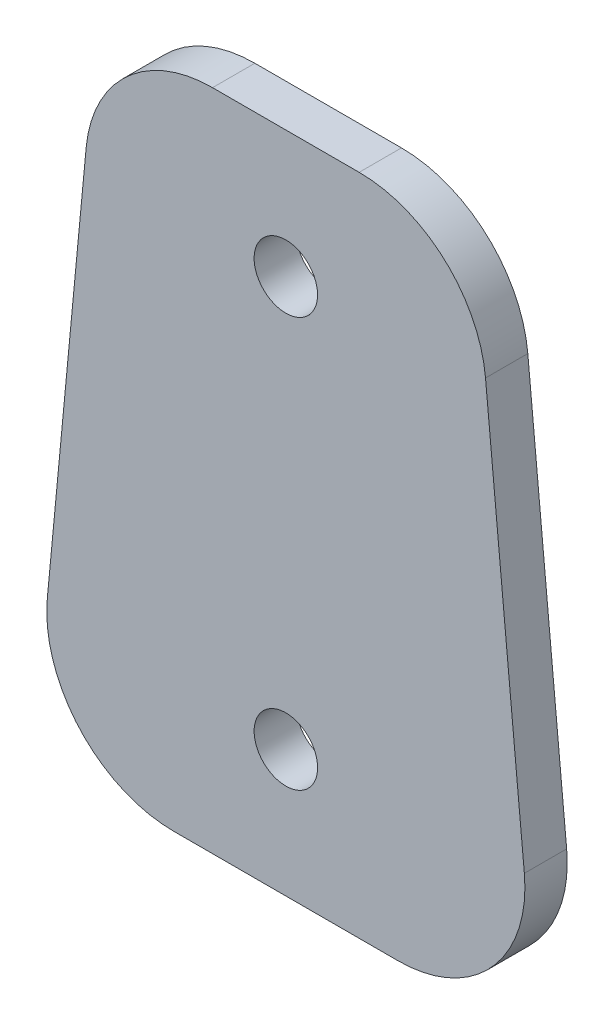
ISO-10303-21;
HEADER;
FILE_DESCRIPTION(('STEP AP214'),'2;1');
FILE_NAME('part.step','',(''),(''),'','','');
FILE_SCHEMA(('AUTOMOTIVE_DESIGN { 1 0 10303 214 1 1 1 1 }'));
ENDSEC;
DATA;
#1=APPLICATION_CONTEXT('core data for automotive mechanical design processes');
#2=APPLICATION_PROTOCOL_DEFINITION('international standard','automotive_design',2000,#1);
#3=PRODUCT_CONTEXT('',#1,'mechanical');
#4=PRODUCT('Part','Part','',(#3));
#5=PRODUCT_RELATED_PRODUCT_CATEGORY('part','',(#4));
#6=PRODUCT_DEFINITION_FORMATION('','',#4);
#7=PRODUCT_DEFINITION_CONTEXT('part definition',#1,'design');
#8=PRODUCT_DEFINITION('design','',#6,#7);
#9=PRODUCT_DEFINITION_SHAPE('','',#8);
#10=(LENGTH_UNIT() NAMED_UNIT(*) SI_UNIT(.MILLI.,.METRE.));
#11=(NAMED_UNIT(*) PLANE_ANGLE_UNIT() SI_UNIT($,.RADIAN.));
#12=(NAMED_UNIT(*) SI_UNIT($,.STERADIAN.) SOLID_ANGLE_UNIT());
#13=UNCERTAINTY_MEASURE_WITH_UNIT(LENGTH_MEASURE(1.E-05),#10,'distance_accuracy_value','');
#14=(GEOMETRIC_REPRESENTATION_CONTEXT(3) GLOBAL_UNCERTAINTY_ASSIGNED_CONTEXT((#13)) GLOBAL_UNIT_ASSIGNED_CONTEXT((#10,
#11,#12)) REPRESENTATION_CONTEXT('',''));
#15=CARTESIAN_POINT('',(0.,0.,0.));
#16=DIRECTION('',(0.,0.,1.));
#17=DIRECTION('',(1.,0.,0.));
#18=AXIS2_PLACEMENT_3D('',#15,#16,#17);
#19=CARTESIAN_POINT('',(18.3110229499816,92.202,3.175));
#20=DIRECTION('',(0.,0.,1.));
#21=DIRECTION('',(1.,0.,0.));
#22=AXIS2_PLACEMENT_3D('',#19,#20,#21);
#23=PLANE('',#22);
#24=CARTESIAN_POINT('',(23.8125,61.468,3.175));
#25=DIRECTION('',(0.,0.,1.));
#26=DIRECTION('',(1.,0.,0.));
#27=AXIS2_PLACEMENT_3D('',#24,#25,#26);
#28=CIRCLE('',#27,2.38125);
#29=CARTESIAN_POINT('',(26.19375,61.468,3.175));
#30=VERTEX_POINT('',#29);
#31=EDGE_CURVE('E134',#30,#30,#28,.T.);
#32=ORIENTED_EDGE('',*,*,#31,.F.);
#33=EDGE_LOOP('',(#32));
#34=FACE_BOUND('',#33,.T.);
#35=CARTESIAN_POINT('',(18.3110229499816,92.202,3.175));
#36=DIRECTION('',(0.,0.,1.));
#37=DIRECTION('',(1.,0.,0.));
#38=AXIS2_PLACEMENT_3D('',#35,#36,#37);
#39=CIRCLE('',#38,9.525);
#40=CARTESIAN_POINT('',(18.3110229499817,101.727,3.175));
#41=VERTEX_POINT('',#40);
#42=CARTESIAN_POINT('',(8.82856196339012,93.1011988866595,3.175));
#43=VERTEX_POINT('',#42);
#44=EDGE_CURVE('E145',#41,#43,#39,.T.);
#45=ORIENTED_EDGE('',*,*,#44,.T.);
#46=DIRECTION('',(-0.0944040825889282,-0.995533961846879,0.));
#47=VECTOR('',#46,1.);
#48=CARTESIAN_POINT('',(8.82856196339012,93.1011988866595,3.175));
#49=LINE('',#48,#47);
#50=CARTESIAN_POINT('',(5.91413092890738,62.3671988866596,3.175));
#51=VERTEX_POINT('',#50);
#52=EDGE_CURVE('E93',#43,#51,#49,.T.);
#53=ORIENTED_EDGE('',*,*,#52,.T.);
#54=CARTESIAN_POINT('',(15.3965919154989,61.468,3.175));
#55=DIRECTION('',(0.,0.,1.));
#56=DIRECTION('',(-1.,0.,0.));
#57=AXIS2_PLACEMENT_3D('',#54,#55,#56);
#58=CIRCLE('',#57,9.525);
#59=CARTESIAN_POINT('',(15.396591915499,51.943,3.175));
#60=VERTEX_POINT('',#59);
#61=EDGE_CURVE('E160',#51,#60,#58,.T.);
#62=ORIENTED_EDGE('',*,*,#61,.T.);
#63=DIRECTION('',(1.,0.,0.));
#64=VECTOR('',#63,1.);
#65=CARTESIAN_POINT('',(15.396591915499,51.943,3.175));
#66=LINE('',#65,#64);
#67=CARTESIAN_POINT('',(32.228408084501,51.943,3.175));
#68=VERTEX_POINT('',#67);
#69=EDGE_CURVE('E173',#60,#68,#66,.T.);
#70=ORIENTED_EDGE('',*,*,#69,.T.);
#71=CARTESIAN_POINT('',(32.2284080845011,61.468,3.175));
#72=DIRECTION('',(0.,0.,1.));
#73=DIRECTION('',(1.,0.,0.));
#74=AXIS2_PLACEMENT_3D('',#71,#72,#73);
#75=CIRCLE('',#74,9.525);
#76=CARTESIAN_POINT('',(41.7108690710926,62.3671988866596,3.175));
#77=VERTEX_POINT('',#76);
#78=EDGE_CURVE('E112',#68,#77,#75,.T.);
#79=ORIENTED_EDGE('',*,*,#78,.T.);
#80=DIRECTION('',(-0.0944040825889281,0.995533961846879,0.));
#81=VECTOR('',#80,1.);
#82=CARTESIAN_POINT('',(41.7108690710926,62.3671988866596,3.175));
#83=LINE('',#82,#81);
#84=CARTESIAN_POINT('',(38.7964380366099,93.1011988866595,3.175));
#85=VERTEX_POINT('',#84);
#86=EDGE_CURVE('E106',#77,#85,#83,.T.);
#87=ORIENTED_EDGE('',*,*,#86,.T.);
#88=CARTESIAN_POINT('',(29.3139770500183,92.202,3.175));
#89=DIRECTION('',(0.,0.,1.));
#90=DIRECTION('',(-1.,0.,0.));
#91=AXIS2_PLACEMENT_3D('',#88,#89,#90);
#92=CIRCLE('',#91,9.525);
#93=CARTESIAN_POINT('',(29.3139770500183,101.727,3.175));
#94=VERTEX_POINT('',#93);
#95=EDGE_CURVE('E110',#85,#94,#92,.T.);
#96=ORIENTED_EDGE('',*,*,#95,.T.);
#97=DIRECTION('',(-1.,0.,0.));
#98=VECTOR('',#97,1.);
#99=CARTESIAN_POINT('',(29.3139770500183,101.727,3.175));
#100=LINE('',#99,#98);
#101=EDGE_CURVE('E50',#94,#41,#100,.T.);
#102=ORIENTED_EDGE('',*,*,#101,.T.);
#103=EDGE_LOOP('',(#45,#53,#62,#70,#79,#87,#96,#102));
#104=FACE_BOUND('',#103,.T.);
#105=CARTESIAN_POINT('',(23.8125,92.202,3.175));
#106=DIRECTION('',(0.,0.,1.));
#107=DIRECTION('',(1.,0.,0.));
#108=AXIS2_PLACEMENT_3D('',#105,#106,#107);
#109=CIRCLE('',#108,2.38125);
#110=CARTESIAN_POINT('',(26.19375,92.202,3.175));
#111=VERTEX_POINT('',#110);
#112=EDGE_CURVE('E182',#111,#111,#109,.T.);
#113=ORIENTED_EDGE('',*,*,#112,.F.);
#114=EDGE_LOOP('',(#113));
#115=FACE_BOUND('',#114,.T.);
#116=ADVANCED_FACE('F33',(#34,#104,#115),#23,.T.);
#117=CARTESIAN_POINT('',(18.3110229499816,92.202,0.));
#118=DIRECTION('',(0.,0.,1.));
#119=DIRECTION('',(1.,0.,0.));
#120=AXIS2_PLACEMENT_3D('',#117,#118,#119);
#121=PLANE('',#120);
#122=CARTESIAN_POINT('',(18.3110229499816,92.202,0.));
#123=DIRECTION('',(0.,0.,1.));
#124=DIRECTION('',(1.,0.,0.));
#125=AXIS2_PLACEMENT_3D('',#122,#123,#124);
#126=CIRCLE('',#125,9.525);
#127=CARTESIAN_POINT('',(18.3110229499817,101.727,0.));
#128=VERTEX_POINT('',#127);
#129=CARTESIAN_POINT('',(8.82856196339012,93.1011988866595,0.));
#130=VERTEX_POINT('',#129);
#131=EDGE_CURVE('E130',#128,#130,#126,.T.);
#132=ORIENTED_EDGE('',*,*,#131,.F.);
#133=DIRECTION('',(-1.,0.,0.));
#134=VECTOR('',#133,1.);
#135=CARTESIAN_POINT('',(29.3139770500183,101.727,0.));
#136=LINE('',#135,#134);
#137=CARTESIAN_POINT('',(29.3139770500183,101.727,0.));
#138=VERTEX_POINT('',#137);
#139=EDGE_CURVE('E85',#138,#128,#136,.T.);
#140=ORIENTED_EDGE('',*,*,#139,.F.);
#141=CARTESIAN_POINT('',(29.3139770500183,92.202,0.));
#142=DIRECTION('',(0.,0.,1.));
#143=DIRECTION('',(-1.,0.,0.));
#144=AXIS2_PLACEMENT_3D('',#141,#142,#143);
#145=CIRCLE('',#144,9.525);
#146=CARTESIAN_POINT('',(38.7964380366099,93.1011988866595,0.));
#147=VERTEX_POINT('',#146);
#148=EDGE_CURVE('E79',#147,#138,#145,.T.);
#149=ORIENTED_EDGE('',*,*,#148,.F.);
#150=DIRECTION('',(-0.0944040825889281,0.995533961846879,0.));
#151=VECTOR('',#150,1.);
#152=CARTESIAN_POINT('',(41.7108690710926,62.3671988866596,0.));
#153=LINE('',#152,#151);
#154=CARTESIAN_POINT('',(41.7108690710926,62.3671988866596,0.));
#155=VERTEX_POINT('',#154);
#156=EDGE_CURVE('E120',#155,#147,#153,.T.);
#157=ORIENTED_EDGE('',*,*,#156,.F.);
#158=CARTESIAN_POINT('',(32.2284080845011,61.468,0.));
#159=DIRECTION('',(0.,0.,1.));
#160=DIRECTION('',(1.,0.,0.));
#161=AXIS2_PLACEMENT_3D('',#158,#159,#160);
#162=CIRCLE('',#161,9.525);
#163=CARTESIAN_POINT('',(32.228408084501,51.943,0.));
#164=VERTEX_POINT('',#163);
#165=EDGE_CURVE('E140',#164,#155,#162,.T.);
#166=ORIENTED_EDGE('',*,*,#165,.F.);
#167=DIRECTION('',(1.,0.,0.));
#168=VECTOR('',#167,1.);
#169=CARTESIAN_POINT('',(15.396591915499,51.943,0.));
#170=LINE('',#169,#168);
#171=CARTESIAN_POINT('',(15.396591915499,51.943,0.));
#172=VERTEX_POINT('',#171);
#173=EDGE_CURVE('E138',#172,#164,#170,.T.);
#174=ORIENTED_EDGE('',*,*,#173,.F.);
#175=CARTESIAN_POINT('',(15.3965919154989,61.468,0.));
#176=DIRECTION('',(0.,0.,1.));
#177=DIRECTION('',(-1.,0.,0.));
#178=AXIS2_PLACEMENT_3D('',#175,#176,#177);
#179=CIRCLE('',#178,9.525);
#180=CARTESIAN_POINT('',(5.91413092890738,62.3671988866596,0.));
#181=VERTEX_POINT('',#180);
#182=EDGE_CURVE('E136',#181,#172,#179,.T.);
#183=ORIENTED_EDGE('',*,*,#182,.F.);
#184=DIRECTION('',(-0.0944040825889282,-0.995533961846879,0.));
#185=VECTOR('',#184,1.);
#186=CARTESIAN_POINT('',(8.82856196339012,93.1011988866595,0.));
#187=LINE('',#186,#185);
#188=EDGE_CURVE('E133',#130,#181,#187,.T.);
#189=ORIENTED_EDGE('',*,*,#188,.F.);
#190=EDGE_LOOP('',(#132,#140,#149,#157,#166,#174,#183,#189));
#191=FACE_BOUND('',#190,.T.);
#192=CARTESIAN_POINT('',(23.8125,61.468,0.));
#193=DIRECTION('',(0.,0.,1.));
#194=DIRECTION('',(1.,0.,0.));
#195=AXIS2_PLACEMENT_3D('',#192,#193,#194);
#196=CIRCLE('',#195,2.38125);
#197=CARTESIAN_POINT('',(26.19375,61.468,0.));
#198=VERTEX_POINT('',#197);
#199=EDGE_CURVE('E179',#198,#198,#196,.T.);
#200=ORIENTED_EDGE('',*,*,#199,.T.);
#201=EDGE_LOOP('',(#200));
#202=FACE_BOUND('',#201,.T.);
#203=CARTESIAN_POINT('',(23.8125,92.202,0.));
#204=DIRECTION('',(0.,0.,1.));
#205=DIRECTION('',(1.,0.,0.));
#206=AXIS2_PLACEMENT_3D('',#203,#204,#205);
#207=CIRCLE('',#206,2.38125);
#208=CARTESIAN_POINT('',(26.19375,92.202,0.));
#209=VERTEX_POINT('',#208);
#210=EDGE_CURVE('E185',#209,#209,#207,.T.);
#211=ORIENTED_EDGE('',*,*,#210,.T.);
#212=EDGE_LOOP('',(#211));
#213=FACE_BOUND('',#212,.T.);
#214=ADVANCED_FACE('F164',(#191,#202,#213),#121,.F.);
#215=CARTESIAN_POINT('',(18.3110229499816,92.202,3.175));
#216=DIRECTION('',(0.,0.,-1.));
#217=DIRECTION('',(-1.,0.,0.));
#218=AXIS2_PLACEMENT_3D('',#215,#216,#217);
#219=CYLINDRICAL_SURFACE('',#218,9.525);
#220=ORIENTED_EDGE('',*,*,#131,.T.);
#221=DIRECTION('',(0.,0.,-1.));
#222=VECTOR('',#221,1.);
#223=CARTESIAN_POINT('',(8.82856196339012,93.1011988866595,3.175));
#224=LINE('',#223,#222);
#225=EDGE_CURVE('E11',#43,#130,#224,.T.);
#226=ORIENTED_EDGE('',*,*,#225,.F.);
#227=ORIENTED_EDGE('',*,*,#44,.F.);
#228=DIRECTION('',(0.,0.,-1.));
#229=VECTOR('',#228,1.);
#230=CARTESIAN_POINT('',(18.3110229499817,101.727,3.175));
#231=LINE('',#230,#229);
#232=EDGE_CURVE('E126',#41,#128,#231,.T.);
#233=ORIENTED_EDGE('',*,*,#232,.T.);
#234=EDGE_LOOP('',(#220,#226,#227,#233));
#235=FACE_BOUND('',#234,.T.);
#236=ADVANCED_FACE('F35',(#235),#219,.T.);
#237=CARTESIAN_POINT('',(8.82856196339012,93.1011988866595,3.175));
#238=DIRECTION('',(0.995533961846879,-0.0944040825889281,0.));
#239=DIRECTION('',(0.0944040825889282,0.995533961846879,0.));
#240=AXIS2_PLACEMENT_3D('',#237,#238,#239);
#241=PLANE('',#240);
#242=ORIENTED_EDGE('',*,*,#188,.T.);
#243=DIRECTION('',(0.,0.,-1.));
#244=VECTOR('',#243,1.);
#245=CARTESIAN_POINT('',(5.91413092890738,62.3671988866596,3.175));
#246=LINE('',#245,#244);
#247=EDGE_CURVE('E42',#51,#181,#246,.T.);
#248=ORIENTED_EDGE('',*,*,#247,.F.);
#249=ORIENTED_EDGE('',*,*,#52,.F.);
#250=ORIENTED_EDGE('',*,*,#225,.T.);
#251=EDGE_LOOP('',(#242,#248,#249,#250));
#252=FACE_BOUND('',#251,.T.);
#253=ADVANCED_FACE('F217',(#252),#241,.F.);
#254=CARTESIAN_POINT('',(15.3965919154989,61.468,3.175));
#255=DIRECTION('',(0.,0.,-1.));
#256=DIRECTION('',(-1.,0.,0.));
#257=AXIS2_PLACEMENT_3D('',#254,#255,#256);
#258=CYLINDRICAL_SURFACE('',#257,9.525);
#259=ORIENTED_EDGE('',*,*,#182,.T.);
#260=DIRECTION('',(0.,0.,-1.));
#261=VECTOR('',#260,1.);
#262=CARTESIAN_POINT('',(15.396591915499,51.943,3.175));
#263=LINE('',#262,#261);
#264=EDGE_CURVE('E152',#60,#172,#263,.T.);
#265=ORIENTED_EDGE('',*,*,#264,.F.);
#266=ORIENTED_EDGE('',*,*,#61,.F.);
#267=ORIENTED_EDGE('',*,*,#247,.T.);
#268=EDGE_LOOP('',(#259,#265,#266,#267));
#269=FACE_BOUND('',#268,.T.);
#270=ADVANCED_FACE('F158',(#269),#258,.T.);
#271=CARTESIAN_POINT('',(15.396591915499,51.943,3.175));
#272=DIRECTION('',(0.,1.,0.));
#273=DIRECTION('',(0.,0.,1.));
#274=AXIS2_PLACEMENT_3D('',#271,#272,#273);
#275=PLANE('',#274);
#276=ORIENTED_EDGE('',*,*,#173,.T.);
#277=DIRECTION('',(0.,0.,-1.));
#278=VECTOR('',#277,1.);
#279=CARTESIAN_POINT('',(32.228408084501,51.943,3.175));
#280=LINE('',#279,#278);
#281=EDGE_CURVE('E149',#68,#164,#280,.T.);
#282=ORIENTED_EDGE('',*,*,#281,.F.);
#283=ORIENTED_EDGE('',*,*,#69,.F.);
#284=ORIENTED_EDGE('',*,*,#264,.T.);
#285=EDGE_LOOP('',(#276,#282,#283,#284));
#286=FACE_BOUND('',#285,.T.);
#287=ADVANCED_FACE('F169',(#286),#275,.F.);
#288=CARTESIAN_POINT('',(32.2284080845011,61.468,3.175));
#289=DIRECTION('',(0.,0.,-1.));
#290=DIRECTION('',(-1.,0.,0.));
#291=AXIS2_PLACEMENT_3D('',#288,#289,#290);
#292=CYLINDRICAL_SURFACE('',#291,9.525);
#293=ORIENTED_EDGE('',*,*,#165,.T.);
#294=DIRECTION('',(0.,0.,-1.));
#295=VECTOR('',#294,1.);
#296=CARTESIAN_POINT('',(41.7108690710926,62.3671988866596,3.175));
#297=LINE('',#296,#295);
#298=EDGE_CURVE('E121',#77,#155,#297,.T.);
#299=ORIENTED_EDGE('',*,*,#298,.F.);
#300=ORIENTED_EDGE('',*,*,#78,.F.);
#301=ORIENTED_EDGE('',*,*,#281,.T.);
#302=EDGE_LOOP('',(#293,#299,#300,#301));
#303=FACE_BOUND('',#302,.T.);
#304=ADVANCED_FACE('F172',(#303),#292,.T.);
#305=CARTESIAN_POINT('',(41.7108690710926,62.3671988866596,3.175));
#306=DIRECTION('',(-0.995533961846879,-0.0944040825889281,0.));
#307=DIRECTION('',(0.0944040825889282,-0.995533961846879,0.));
#308=AXIS2_PLACEMENT_3D('',#305,#306,#307);
#309=PLANE('',#308);
#310=ORIENTED_EDGE('',*,*,#156,.T.);
#311=DIRECTION('',(0.,0.,-1.));
#312=VECTOR('',#311,1.);
#313=CARTESIAN_POINT('',(38.7964380366099,93.1011988866595,3.175));
#314=LINE('',#313,#312);
#315=EDGE_CURVE('E117',#85,#147,#314,.T.);
#316=ORIENTED_EDGE('',*,*,#315,.F.);
#317=ORIENTED_EDGE('',*,*,#86,.F.);
#318=ORIENTED_EDGE('',*,*,#298,.T.);
#319=EDGE_LOOP('',(#310,#316,#317,#318));
#320=FACE_BOUND('',#319,.T.);
#321=ADVANCED_FACE('F118',(#320),#309,.F.);
#322=CARTESIAN_POINT('',(29.3139770500183,92.202,3.175));
#323=DIRECTION('',(0.,0.,-1.));
#324=DIRECTION('',(-1.,0.,0.));
#325=AXIS2_PLACEMENT_3D('',#322,#323,#324);
#326=CYLINDRICAL_SURFACE('',#325,9.525);
#327=ORIENTED_EDGE('',*,*,#148,.T.);
#328=DIRECTION('',(0.,0.,-1.));
#329=VECTOR('',#328,1.);
#330=CARTESIAN_POINT('',(29.3139770500183,101.727,3.175));
#331=LINE('',#330,#329);
#332=EDGE_CURVE('E122',#94,#138,#331,.T.);
#333=ORIENTED_EDGE('',*,*,#332,.F.);
#334=ORIENTED_EDGE('',*,*,#95,.F.);
#335=ORIENTED_EDGE('',*,*,#315,.T.);
#336=EDGE_LOOP('',(#327,#333,#334,#335));
#337=FACE_BOUND('',#336,.T.);
#338=ADVANCED_FACE('F124',(#337),#326,.T.);
#339=CARTESIAN_POINT('',(29.3139770500183,101.727,3.175));
#340=DIRECTION('',(0.,-1.,0.));
#341=DIRECTION('',(0.,0.,-1.));
#342=AXIS2_PLACEMENT_3D('',#339,#340,#341);
#343=PLANE('',#342);
#344=ORIENTED_EDGE('',*,*,#139,.T.);
#345=ORIENTED_EDGE('',*,*,#232,.F.);
#346=ORIENTED_EDGE('',*,*,#101,.F.);
#347=ORIENTED_EDGE('',*,*,#332,.T.);
#348=EDGE_LOOP('',(#344,#345,#346,#347));
#349=FACE_BOUND('',#348,.T.);
#350=ADVANCED_FACE('F205',(#349),#343,.F.);
#351=CARTESIAN_POINT('',(23.8125,61.468,3.175));
#352=DIRECTION('',(0.,0.,-1.));
#353=DIRECTION('',(-1.,0.,0.));
#354=AXIS2_PLACEMENT_3D('',#351,#352,#353);
#355=CYLINDRICAL_SURFACE('',#354,2.38125);
#356=ORIENTED_EDGE('',*,*,#31,.T.);
#357=EDGE_LOOP('',(#356));
#358=FACE_BOUND('',#357,.T.);
#359=ORIENTED_EDGE('',*,*,#199,.F.);
#360=EDGE_LOOP('',(#359));
#361=FACE_BOUND('',#360,.T.);
#362=ADVANCED_FACE('F202',(#358,#361),#355,.F.);
#363=CARTESIAN_POINT('',(23.8125,92.202,3.175));
#364=DIRECTION('',(0.,0.,-1.));
#365=DIRECTION('',(-1.,0.,0.));
#366=AXIS2_PLACEMENT_3D('',#363,#364,#365);
#367=CYLINDRICAL_SURFACE('',#366,2.38125);
#368=ORIENTED_EDGE('',*,*,#112,.T.);
#369=EDGE_LOOP('',(#368));
#370=FACE_BOUND('',#369,.T.);
#371=ORIENTED_EDGE('',*,*,#210,.F.);
#372=EDGE_LOOP('',(#371));
#373=FACE_BOUND('',#372,.T.);
#374=ADVANCED_FACE('F191',(#370,#373),#367,.F.);
#375=CLOSED_SHELL('',(#116,#214,#236,#253,#270,#287,#304,#321,#338,#350,#362,#374));
#376=MANIFOLD_SOLID_BREP('B2',#375);
#377=ADVANCED_BREP_SHAPE_REPRESENTATION('',(#18,#376),#14);
#378=SHAPE_DEFINITION_REPRESENTATION(#9,#377);
ENDSEC;
END-ISO-10303-21;
